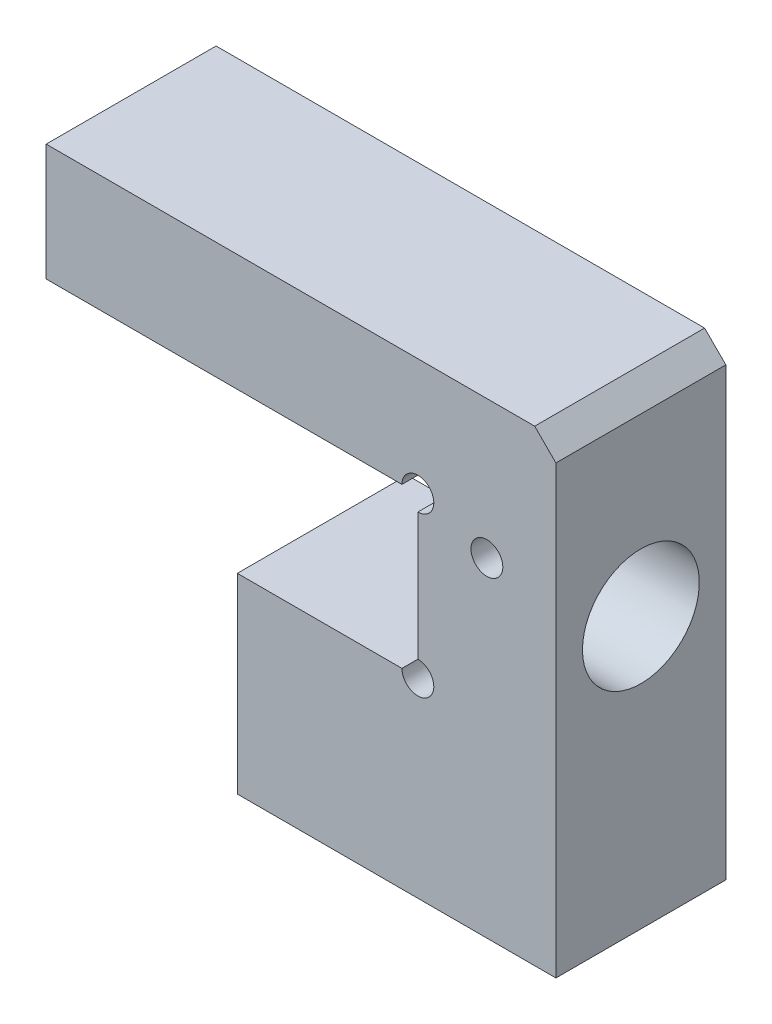
ISO-10303-21;
HEADER;
FILE_DESCRIPTION(('STEP AP214'),'2;1');
FILE_NAME('part.step','',(''),(''),'','','');
FILE_SCHEMA(('AUTOMOTIVE_DESIGN { 1 0 10303 214 1 1 1 1 }'));
ENDSEC;
DATA;
#1=APPLICATION_CONTEXT('core data for automotive mechanical design processes');
#2=APPLICATION_PROTOCOL_DEFINITION('international standard','automotive_design',2000,#1);
#3=PRODUCT_CONTEXT('',#1,'mechanical');
#4=PRODUCT('Part','Part','',(#3));
#5=PRODUCT_RELATED_PRODUCT_CATEGORY('part','',(#4));
#6=PRODUCT_DEFINITION_FORMATION('','',#4);
#7=PRODUCT_DEFINITION_CONTEXT('part definition',#1,'design');
#8=PRODUCT_DEFINITION('design','',#6,#7);
#9=PRODUCT_DEFINITION_SHAPE('','',#8);
#10=(LENGTH_UNIT() NAMED_UNIT(*) SI_UNIT(.MILLI.,.METRE.));
#11=(NAMED_UNIT(*) PLANE_ANGLE_UNIT() SI_UNIT($,.RADIAN.));
#12=(NAMED_UNIT(*) SI_UNIT($,.STERADIAN.) SOLID_ANGLE_UNIT());
#13=UNCERTAINTY_MEASURE_WITH_UNIT(LENGTH_MEASURE(1.E-05),#10,'distance_accuracy_value','');
#14=(GEOMETRIC_REPRESENTATION_CONTEXT(3) GLOBAL_UNCERTAINTY_ASSIGNED_CONTEXT((#13)) GLOBAL_UNIT_ASSIGNED_CONTEXT((#10,
#11,#12)) REPRESENTATION_CONTEXT('',''));
#15=CARTESIAN_POINT('',(0.,0.,0.));
#16=DIRECTION('',(0.,0.,1.));
#17=DIRECTION('',(1.,0.,0.));
#18=AXIS2_PLACEMENT_3D('',#15,#16,#17);
#19=CARTESIAN_POINT('',(35.,-26.,16.));
#20=DIRECTION('',(0.,0.,-1.));
#21=DIRECTION('',(-1.,0.,0.));
#22=AXIS2_PLACEMENT_3D('',#19,#20,#21);
#23=CYLINDRICAL_SURFACE('',#22,1.5);
#24=CARTESIAN_POINT('',(35.,-26.,0.));
#25=DIRECTION('',(0.,0.,1.));
#26=DIRECTION('',(1.,0.,0.));
#27=AXIS2_PLACEMENT_3D('',#24,#25,#26);
#28=CIRCLE('',#27,1.5);
#29=CARTESIAN_POINT('',(33.5,-26.,0.));
#30=VERTEX_POINT('',#29);
#31=CARTESIAN_POINT('',(35.,-24.5,0.));
#32=VERTEX_POINT('',#31);
#33=EDGE_CURVE('E134',#30,#32,#28,.T.);
#34=ORIENTED_EDGE('',*,*,#33,.F.);
#35=DIRECTION('',(0.,0.,-1.));
#36=VECTOR('',#35,1.);
#37=CARTESIAN_POINT('',(33.5,-26.,16.));
#38=LINE('',#37,#36);
#39=CARTESIAN_POINT('',(33.5,-26.,16.));
#40=VERTEX_POINT('',#39);
#41=EDGE_CURVE('E129',#40,#30,#38,.T.);
#42=ORIENTED_EDGE('',*,*,#41,.F.);
#43=CARTESIAN_POINT('',(35.,-26.,16.));
#44=DIRECTION('',(0.,0.,1.));
#45=DIRECTION('',(1.,0.,0.));
#46=AXIS2_PLACEMENT_3D('',#43,#44,#45);
#47=CIRCLE('',#46,1.5);
#48=CARTESIAN_POINT('',(35.,-24.5,16.));
#49=VERTEX_POINT('',#48);
#50=EDGE_CURVE('E132',#40,#49,#47,.T.);
#51=ORIENTED_EDGE('',*,*,#50,.T.);
#52=DIRECTION('',(0.,0.,-1.));
#53=VECTOR('',#52,1.);
#54=CARTESIAN_POINT('',(35.,-24.5,16.));
#55=LINE('',#54,#53);
#56=EDGE_CURVE('E192',#49,#32,#55,.T.);
#57=ORIENTED_EDGE('',*,*,#56,.T.);
#58=EDGE_LOOP('',(#34,#42,#51,#57));
#59=FACE_BOUND('',#58,.T.);
#60=ADVANCED_FACE('F46',(#59),#23,.F.);
#61=CARTESIAN_POINT('',(0.,-26.,16.));
#62=DIRECTION('',(0.,-1.,0.));
#63=DIRECTION('',(1.,0.,0.));
#64=AXIS2_PLACEMENT_3D('',#61,#62,#63);
#65=PLANE('',#64);
#66=DIRECTION('',(-1.,0.,0.));
#67=VECTOR('',#66,1.);
#68=CARTESIAN_POINT('',(0.,-26.,0.));
#69=LINE('',#68,#67);
#70=CARTESIAN_POINT('',(18.,-26.,0.));
#71=VERTEX_POINT('',#70);
#72=EDGE_CURVE('E200',#30,#71,#69,.T.);
#73=ORIENTED_EDGE('',*,*,#72,.T.);
#74=DIRECTION('',(0.,0.,-1.));
#75=VECTOR('',#74,1.);
#76=CARTESIAN_POINT('',(18.,-26.,16.));
#77=LINE('',#76,#75);
#78=CARTESIAN_POINT('',(18.,-26.,16.));
#79=VERTEX_POINT('',#78);
#80=EDGE_CURVE('E140',#79,#71,#77,.T.);
#81=ORIENTED_EDGE('',*,*,#80,.F.);
#82=DIRECTION('',(-1.,0.,0.));
#83=VECTOR('',#82,1.);
#84=CARTESIAN_POINT('',(0.,-26.,16.));
#85=LINE('',#84,#83);
#86=EDGE_CURVE('E144',#40,#79,#85,.T.);
#87=ORIENTED_EDGE('',*,*,#86,.F.);
#88=ORIENTED_EDGE('',*,*,#41,.T.);
#89=EDGE_LOOP('',(#73,#81,#87,#88));
#90=FACE_BOUND('',#89,.T.);
#91=ADVANCED_FACE('F145',(#90),#65,.F.);
#92=CARTESIAN_POINT('',(18.,0.,16.));
#93=DIRECTION('',(1.,0.,0.));
#94=DIRECTION('',(0.,1.,0.));
#95=AXIS2_PLACEMENT_3D('',#92,#93,#94);
#96=PLANE('',#95);
#97=DIRECTION('',(0.,-1.,0.));
#98=VECTOR('',#97,1.);
#99=CARTESIAN_POINT('',(18.,0.,0.));
#100=LINE('',#99,#98);
#101=CARTESIAN_POINT('',(18.,-44.,0.));
#102=VERTEX_POINT('',#101);
#103=EDGE_CURVE('E203',#71,#102,#100,.T.);
#104=ORIENTED_EDGE('',*,*,#103,.T.);
#105=DIRECTION('',(0.,0.,-1.));
#106=VECTOR('',#105,1.);
#107=CARTESIAN_POINT('',(18.,-44.,16.));
#108=LINE('',#107,#106);
#109=CARTESIAN_POINT('',(18.,-44.,16.));
#110=VERTEX_POINT('',#109);
#111=EDGE_CURVE('E251',#110,#102,#108,.T.);
#112=ORIENTED_EDGE('',*,*,#111,.F.);
#113=DIRECTION('',(0.,-1.,0.));
#114=VECTOR('',#113,1.);
#115=CARTESIAN_POINT('',(18.,0.,16.));
#116=LINE('',#115,#114);
#117=EDGE_CURVE('E150',#79,#110,#116,.T.);
#118=ORIENTED_EDGE('',*,*,#117,.F.);
#119=ORIENTED_EDGE('',*,*,#80,.T.);
#120=EDGE_LOOP('',(#104,#112,#118,#119));
#121=FACE_BOUND('',#120,.T.);
#122=ADVANCED_FACE('F291',(#121),#96,.F.);
#123=CARTESIAN_POINT('',(0.,-44.,16.));
#124=DIRECTION('',(0.,1.,0.));
#125=DIRECTION('',(0.,0.,1.));
#126=AXIS2_PLACEMENT_3D('',#123,#124,#125);
#127=PLANE('',#126);
#128=CARTESIAN_POINT('',(41.5,-44.,8.));
#129=DIRECTION('',(0.,-1.,0.));
#130=DIRECTION('',(0.,0.,-1.));
#131=AXIS2_PLACEMENT_3D('',#128,#129,#130);
#132=CIRCLE('',#131,3.);
#133=CARTESIAN_POINT('',(41.5,-44.,5.));
#134=VERTEX_POINT('',#133);
#135=EDGE_CURVE('E521',#134,#134,#132,.T.);
#136=ORIENTED_EDGE('',*,*,#135,.F.);
#137=EDGE_LOOP('',(#136));
#138=FACE_BOUND('',#137,.T.);
#139=DIRECTION('',(1.,0.,0.));
#140=VECTOR('',#139,1.);
#141=CARTESIAN_POINT('',(0.,-44.,0.));
#142=LINE('',#141,#140);
#143=CARTESIAN_POINT('',(48.,-44.,0.));
#144=VERTEX_POINT('',#143);
#145=EDGE_CURVE('E207',#102,#144,#142,.T.);
#146=ORIENTED_EDGE('',*,*,#145,.T.);
#147=DIRECTION('',(0.,0.,-1.));
#148=VECTOR('',#147,1.);
#149=CARTESIAN_POINT('',(48.,-44.,16.));
#150=LINE('',#149,#148);
#151=CARTESIAN_POINT('',(48.,-44.,16.));
#152=VERTEX_POINT('',#151);
#153=EDGE_CURVE('E247',#152,#144,#150,.T.);
#154=ORIENTED_EDGE('',*,*,#153,.F.);
#155=DIRECTION('',(1.,0.,0.));
#156=VECTOR('',#155,1.);
#157=CARTESIAN_POINT('',(0.,-44.,16.));
#158=LINE('',#157,#156);
#159=EDGE_CURVE('E168',#110,#152,#158,.T.);
#160=ORIENTED_EDGE('',*,*,#159,.F.);
#161=ORIENTED_EDGE('',*,*,#111,.T.);
#162=EDGE_LOOP('',(#146,#154,#160,#161));
#163=FACE_BOUND('',#162,.T.);
#164=ADVANCED_FACE('F333',(#138,#163),#127,.F.);
#165=CARTESIAN_POINT('',(48.,0.,16.));
#166=DIRECTION('',(1.,0.,0.));
#167=DIRECTION('',(0.,1.,0.));
#168=AXIS2_PLACEMENT_3D('',#165,#166,#167);
#169=PLANE('',#168);
#170=CARTESIAN_POINT('',(48.,-18.5,8.));
#171=DIRECTION('',(-1.,0.,0.));
#172=DIRECTION('',(0.,0.,1.));
#173=AXIS2_PLACEMENT_3D('',#170,#171,#172);
#174=CIRCLE('',#173,5.5);
#175=CARTESIAN_POINT('',(48.,-18.5,13.5));
#176=VERTEX_POINT('',#175);
#177=EDGE_CURVE('E306',#176,#176,#174,.T.);
#178=ORIENTED_EDGE('',*,*,#177,.T.);
#179=EDGE_LOOP('',(#178));
#180=FACE_BOUND('',#179,.T.);
#181=DIRECTION('',(0.,-1.,0.));
#182=VECTOR('',#181,1.);
#183=CARTESIAN_POINT('',(48.,0.,0.));
#184=LINE('',#183,#182);
#185=CARTESIAN_POINT('',(48.,-2.00000000000002,0.));
#186=VERTEX_POINT('',#185);
#187=EDGE_CURVE('E211',#186,#144,#184,.T.);
#188=ORIENTED_EDGE('',*,*,#187,.F.);
#189=DIRECTION('',(0.,0.,1.));
#190=VECTOR('',#189,1.);
#191=CARTESIAN_POINT('',(48.,-2.00000000000002,16.));
#192=LINE('',#191,#190);
#193=CARTESIAN_POINT('',(48.,-2.00000000000002,16.));
#194=VERTEX_POINT('',#193);
#195=EDGE_CURVE('E56',#186,#194,#192,.T.);
#196=ORIENTED_EDGE('',*,*,#195,.T.);
#197=DIRECTION('',(0.,-1.,0.));
#198=VECTOR('',#197,1.);
#199=CARTESIAN_POINT('',(48.,0.,16.));
#200=LINE('',#199,#198);
#201=EDGE_CURVE('E172',#194,#152,#200,.T.);
#202=ORIENTED_EDGE('',*,*,#201,.T.);
#203=ORIENTED_EDGE('',*,*,#153,.T.);
#204=EDGE_LOOP('',(#188,#196,#202,#203));
#205=FACE_BOUND('',#204,.T.);
#206=ADVANCED_FACE('F330',(#180,#205),#169,.T.);
#207=CARTESIAN_POINT('',(0.,0.,16.));
#208=DIRECTION('',(0.,1.,0.));
#209=DIRECTION('',(0.,0.,1.));
#210=AXIS2_PLACEMENT_3D('',#207,#208,#209);
#211=PLANE('',#210);
#212=DIRECTION('',(1.,0.,0.));
#213=VECTOR('',#212,1.);
#214=CARTESIAN_POINT('',(0.,0.,16.));
#215=LINE('',#214,#213);
#216=CARTESIAN_POINT('',(0.,0.,16.));
#217=VERTEX_POINT('',#216);
#218=CARTESIAN_POINT('',(46.,0.,16.));
#219=VERTEX_POINT('',#218);
#220=EDGE_CURVE('E175',#217,#219,#215,.T.);
#221=ORIENTED_EDGE('',*,*,#220,.T.);
#222=DIRECTION('',(0.,0.,-1.));
#223=VECTOR('',#222,1.);
#224=CARTESIAN_POINT('',(46.,0.,16.));
#225=LINE('',#224,#223);
#226=CARTESIAN_POINT('',(46.,0.,0.));
#227=VERTEX_POINT('',#226);
#228=EDGE_CURVE('E139',#219,#227,#225,.T.);
#229=ORIENTED_EDGE('',*,*,#228,.T.);
#230=DIRECTION('',(1.,0.,0.));
#231=VECTOR('',#230,1.);
#232=CARTESIAN_POINT('',(0.,0.,0.));
#233=LINE('',#232,#231);
#234=CARTESIAN_POINT('',(0.,0.,0.));
#235=VERTEX_POINT('',#234);
#236=EDGE_CURVE('E214',#235,#227,#233,.T.);
#237=ORIENTED_EDGE('',*,*,#236,.F.);
#238=DIRECTION('',(0.,0.,-1.));
#239=VECTOR('',#238,1.);
#240=CARTESIAN_POINT('',(0.,0.,16.));
#241=LINE('',#240,#239);
#242=EDGE_CURVE('E244',#217,#235,#241,.T.);
#243=ORIENTED_EDGE('',*,*,#242,.F.);
#244=EDGE_LOOP('',(#221,#229,#237,#243));
#245=FACE_BOUND('',#244,.T.);
#246=ADVANCED_FACE('F265',(#245),#211,.T.);
#247=CARTESIAN_POINT('',(0.,0.,16.));
#248=DIRECTION('',(1.,0.,0.));
#249=DIRECTION('',(0.,1.,0.));
#250=AXIS2_PLACEMENT_3D('',#247,#248,#249);
#251=PLANE('',#250);
#252=DIRECTION('',(0.,-1.,0.));
#253=VECTOR('',#252,1.);
#254=CARTESIAN_POINT('',(0.,0.,0.));
#255=LINE('',#254,#253);
#256=CARTESIAN_POINT('',(0.,-11.,0.));
#257=VERTEX_POINT('',#256);
#258=EDGE_CURVE('E217',#235,#257,#255,.T.);
#259=ORIENTED_EDGE('',*,*,#258,.T.);
#260=DIRECTION('',(0.,0.,-1.));
#261=VECTOR('',#260,1.);
#262=CARTESIAN_POINT('',(0.,-11.,16.));
#263=LINE('',#262,#261);
#264=CARTESIAN_POINT('',(0.,-11.,16.));
#265=VERTEX_POINT('',#264);
#266=EDGE_CURVE('E240',#265,#257,#263,.T.);
#267=ORIENTED_EDGE('',*,*,#266,.F.);
#268=DIRECTION('',(0.,-1.,0.));
#269=VECTOR('',#268,1.);
#270=CARTESIAN_POINT('',(0.,0.,16.));
#271=LINE('',#270,#269);
#272=EDGE_CURVE('E179',#217,#265,#271,.T.);
#273=ORIENTED_EDGE('',*,*,#272,.F.);
#274=ORIENTED_EDGE('',*,*,#242,.T.);
#275=EDGE_LOOP('',(#259,#267,#273,#274));
#276=FACE_BOUND('',#275,.T.);
#277=ADVANCED_FACE('F273',(#276),#251,.F.);
#278=CARTESIAN_POINT('',(0.,-11.,16.));
#279=DIRECTION('',(0.,1.,0.));
#280=DIRECTION('',(0.,0.,1.));
#281=AXIS2_PLACEMENT_3D('',#278,#279,#280);
#282=PLANE('',#281);
#283=DIRECTION('',(1.,0.,0.));
#284=VECTOR('',#283,1.);
#285=CARTESIAN_POINT('',(0.,-11.,0.));
#286=LINE('',#285,#284);
#287=CARTESIAN_POINT('',(33.5,-11.,0.));
#288=VERTEX_POINT('',#287);
#289=EDGE_CURVE('E221',#257,#288,#286,.T.);
#290=ORIENTED_EDGE('',*,*,#289,.T.);
#291=DIRECTION('',(0.,0.,-1.));
#292=VECTOR('',#291,1.);
#293=CARTESIAN_POINT('',(33.5,-11.,16.));
#294=LINE('',#293,#292);
#295=CARTESIAN_POINT('',(33.5,-11.,16.));
#296=VERTEX_POINT('',#295);
#297=EDGE_CURVE('E237',#296,#288,#294,.T.);
#298=ORIENTED_EDGE('',*,*,#297,.F.);
#299=DIRECTION('',(1.,0.,0.));
#300=VECTOR('',#299,1.);
#301=CARTESIAN_POINT('',(0.,-11.,16.));
#302=LINE('',#301,#300);
#303=EDGE_CURVE('E183',#265,#296,#302,.T.);
#304=ORIENTED_EDGE('',*,*,#303,.F.);
#305=ORIENTED_EDGE('',*,*,#266,.T.);
#306=EDGE_LOOP('',(#290,#298,#304,#305));
#307=FACE_BOUND('',#306,.T.);
#308=ADVANCED_FACE('F321',(#307),#282,.F.);
#309=CARTESIAN_POINT('',(35.,-11.,16.));
#310=DIRECTION('',(0.,0.,-1.));
#311=DIRECTION('',(-1.,0.,0.));
#312=AXIS2_PLACEMENT_3D('',#309,#310,#311);
#313=CYLINDRICAL_SURFACE('',#312,1.5);
#314=CARTESIAN_POINT('',(35.,-11.,0.));
#315=DIRECTION('',(0.,0.,1.));
#316=DIRECTION('',(1.,0.,0.));
#317=AXIS2_PLACEMENT_3D('',#314,#315,#316);
#318=CIRCLE('',#317,1.5);
#319=CARTESIAN_POINT('',(35.,-12.5,0.));
#320=VERTEX_POINT('',#319);
#321=EDGE_CURVE('E225',#320,#288,#318,.T.);
#322=ORIENTED_EDGE('',*,*,#321,.F.);
#323=DIRECTION('',(0.,0.,-1.));
#324=VECTOR('',#323,1.);
#325=CARTESIAN_POINT('',(35.,-12.5,16.));
#326=LINE('',#325,#324);
#327=CARTESIAN_POINT('',(35.,-12.5,16.));
#328=VERTEX_POINT('',#327);
#329=EDGE_CURVE('E234',#328,#320,#326,.T.);
#330=ORIENTED_EDGE('',*,*,#329,.F.);
#331=CARTESIAN_POINT('',(35.,-11.,16.));
#332=DIRECTION('',(0.,0.,1.));
#333=DIRECTION('',(1.,0.,0.));
#334=AXIS2_PLACEMENT_3D('',#331,#332,#333);
#335=CIRCLE('',#334,1.5);
#336=EDGE_CURVE('E186',#328,#296,#335,.T.);
#337=ORIENTED_EDGE('',*,*,#336,.T.);
#338=ORIENTED_EDGE('',*,*,#297,.T.);
#339=EDGE_LOOP('',(#322,#330,#337,#338));
#340=FACE_BOUND('',#339,.T.);
#341=ADVANCED_FACE('F298',(#340),#313,.F.);
#342=CARTESIAN_POINT('',(41.5,-13.,16.));
#343=DIRECTION('',(0.,0.,-1.));
#344=DIRECTION('',(-1.,0.,0.));
#345=AXIS2_PLACEMENT_3D('',#342,#343,#344);
#346=CYLINDRICAL_SURFACE('',#345,1.5);
#347=CARTESIAN_POINT('',(40.,-13.,8.));
#348=CARTESIAN_POINT('',(40.0000050460556,-12.999999264418,8.12652755992512));
#349=CARTESIAN_POINT('',(39.999982311627,-13.0043670886456,8.25304110628278));
#350=CARTESIAN_POINT('',(40.0001319667409,-13.0218180023314,8.50550114134522));
#351=CARTESIAN_POINT('',(40.0003043984022,-13.0349029727908,8.63144750175515));
#352=CARTESIAN_POINT('',(40.0015215467077,-13.0697504218392,8.88229698887765));
#353=CARTESIAN_POINT('',(40.0025674113019,-13.0915243005562,9.00719852406653));
#354=CARTESIAN_POINT('',(40.0066635692424,-13.1436366475958,9.25515427577499));
#355=CARTESIAN_POINT('',(40.0097134152429,-13.1739732036222,9.37820889830912));
#356=CARTESIAN_POINT('',(40.018334242777,-13.2353693960465,9.59479655254642));
#357=CARTESIAN_POINT('',(40.0231965938462,-13.2647784176286,9.68882762063051));
#358=CARTESIAN_POINT('',(40.0360572125426,-13.3285274262398,9.87497887554695));
#359=CARTESIAN_POINT('',(40.0440548849326,-13.3628664765249,9.96709942159652));
#360=CARTESIAN_POINT('',(40.064319567435,-13.4361965341698,10.1488311646454));
#361=CARTESIAN_POINT('',(40.076579488947,-13.4751797474417,10.2384462627795));
#362=CARTESIAN_POINT('',(40.1067416181981,-13.5574479769443,10.4146698889756));
#363=CARTESIAN_POINT('',(40.1246409806222,-13.6007308163241,10.5012799088057));
#364=CARTESIAN_POINT('',(40.1726849316218,-13.7014565402623,10.6903395491381));
#365=CARTESIAN_POINT('',(40.2047034683073,-13.7598601494252,10.7918239108702));
#366=CARTESIAN_POINT('',(40.2833193148084,-13.8802528014961,10.9868017577228));
#367=CARTESIAN_POINT('',(40.3298976997482,-13.9422371054464,11.0803054164453));
#368=CARTESIAN_POINT('',(40.4265252496017,-14.0494615544748,11.2324832066374));
#369=CARTESIAN_POINT('',(40.4723269798451,-14.0947534697852,11.2937909277011));
#370=CARTESIAN_POINT('',(40.5750767790373,-14.1828259418697,11.4084011892389));
#371=CARTESIAN_POINT('',(40.6320074443272,-14.2256102859632,11.4617160020786));
#372=CARTESIAN_POINT('',(40.7436899811321,-14.2966722780706,11.5474554053403));
#373=CARTESIAN_POINT('',(40.7961697927703,-14.3260714006203,11.581895861046));
#374=CARTESIAN_POINT('',(40.9078519592442,-14.3795598356942,11.6432994174372));
#375=CARTESIAN_POINT('',(40.967051861625,-14.4036510759174,11.6702652336588));
#376=CARTESIAN_POINT('',(41.0915540027052,-14.4448182093362,11.7157043872351));
#377=CARTESIAN_POINT('',(41.1569009496812,-14.4618368992159,11.7341086151923));
#378=CARTESIAN_POINT('',(41.2912422736374,-14.4869686414872,11.7611077099506));
#379=CARTESIAN_POINT('',(41.3602338680508,-14.4950883878025,11.7697099501529));
#380=CARTESIAN_POINT('',(41.4900473226128,-14.5011866968422,11.7761756729014));
#381=CARTESIAN_POINT('',(41.5507556366204,-14.5003542632437,11.7752981525243));
#382=CARTESIAN_POINT('',(41.6710117332296,-14.4914377140364,11.765829368413));
#383=CARTESIAN_POINT('',(41.7305597918081,-14.4833553449451,11.7572399624799));
#384=CARTESIAN_POINT('',(41.8447369023462,-14.4609676074607,11.733158431321));
#385=CARTESIAN_POINT('',(41.8994651925059,-14.4468901202217,11.7179186170347));
#386=CARTESIAN_POINT('',(42.0050642955728,-14.4134990852317,11.6811851206613));
#387=CARTESIAN_POINT('',(42.0559344406832,-14.3941846336623,11.6596903590211));
#388=CARTESIAN_POINT('',(42.1574533555582,-14.3494832412946,11.6089399925611));
#389=CARTESIAN_POINT('',(42.207663593704,-14.3237044239853,11.5791573179122));
#390=CARTESIAN_POINT('',(42.3021376648118,-14.2686883253997,11.5139478081336));
#391=CARTESIAN_POINT('',(42.3463979457714,-14.2394489976807,11.4785176288994));
#392=CARTESIAN_POINT('',(42.4528586029308,-14.1612913106921,11.3810364295307));
#393=CARTESIAN_POINT('',(42.5106382798919,-14.1107683175695,11.3154366963677));
#394=CARTESIAN_POINT('',(42.6128165548254,-14.0084154161653,11.1754109081402));
#395=CARTESIAN_POINT('',(42.6571815607545,-13.9565825734836,11.10096333517));
#396=CARTESIAN_POINT('',(42.7261529933264,-13.8654808655544,10.9625238598628));
#397=CARTESIAN_POINT('',(42.7529581556088,-13.8259310648425,10.8997790524862));
#398=CARTESIAN_POINT('',(42.8007005843685,-13.7484980516631,10.7710774542215));
#399=CARTESIAN_POINT('',(42.8216343778249,-13.7106158367238,10.7051187892368));
#400=CARTESIAN_POINT('',(42.8586263950086,-13.6370496240798,10.5705269505919));
#401=CARTESIAN_POINT('',(42.8746761770893,-13.6013695164315,10.5018893750078));
#402=CARTESIAN_POINT('',(42.9027368940712,-13.5326395799606,10.3624937816372));
#403=CARTESIAN_POINT('',(42.9147464041871,-13.499590682153,10.2917350253852));
#404=CARTESIAN_POINT('',(42.9426063168664,-13.4147747344694,10.0994862103933));
#405=CARTESIAN_POINT('',(42.9554692628489,-13.3656579776342,9.97638586883114));
#406=CARTESIAN_POINT('',(42.9750366354042,-13.2763195723764,9.72650097346295));
#407=CARTESIAN_POINT('',(42.9817369877003,-13.2361038219979,9.59971403938928));
#408=CARTESIAN_POINT('',(42.9913396986822,-13.1649136604004,9.34334042976084));
#409=CARTESIAN_POINT('',(42.9942392170035,-13.1339461737407,9.2137517338734));
#410=CARTESIAN_POINT('',(42.9980145402145,-13.0815009288207,8.95267823299505));
#411=CARTESIAN_POINT('',(42.9988907699241,-13.0600211792325,8.8211938318711));
#412=CARTESIAN_POINT('',(42.9998823727309,-13.0257732254375,8.54999759612709));
#413=CARTESIAN_POINT('',(42.9999549098346,-13.0135277038558,8.41021937711491));
#414=CARTESIAN_POINT('',(43.0000156997697,-12.9997516795259,8.13012319267219));
#415=CARTESIAN_POINT('',(43.0000039440339,-12.9982222659377,7.9898051738278));
#416=CARTESIAN_POINT('',(42.9999932361439,-13.005890966899,7.70940551883653));
#417=CARTESIAN_POINT('',(42.9999942892487,-13.0150934862396,7.56932400339871));
#418=CARTESIAN_POINT('',(42.9994201150092,-13.0441790370849,7.29028909646159));
#419=CARTESIAN_POINT('',(42.9988449641385,-13.0640606511037,7.15133555772498));
#420=CARTESIAN_POINT('',(42.9960168180687,-13.1114741668456,6.89131541217134));
#421=CARTESIAN_POINT('',(42.9939652502822,-13.1378574798256,6.77003625510019));
#422=CARTESIAN_POINT('',(42.9870906278171,-13.1987518691786,6.5295749167285));
#423=CARTESIAN_POINT('',(42.9822670114085,-13.2332645920647,6.41039316549427));
#424=CARTESIAN_POINT('',(42.96811736611,-13.3100879888254,6.17514862522296));
#425=CARTESIAN_POINT('',(42.9588025385292,-13.3523791015512,6.05907883101493));
#426=CARTESIAN_POINT('',(42.933460771756,-13.4443723933926,5.83072409678411));
#427=CARTESIAN_POINT('',(42.9174390661743,-13.4940687744867,5.71843627921196));
#428=CARTESIAN_POINT('',(42.8757741590904,-13.6004448473875,5.49811934723013));
#429=CARTESIAN_POINT('',(42.8500726704525,-13.6571654181859,5.39012050394642));
#430=CARTESIAN_POINT('',(42.785546798799,-13.7758419134477,5.18100748092275));
#431=CARTESIAN_POINT('',(42.7467301636709,-13.8377947307459,5.07988927865812));
#432=CARTESIAN_POINT('',(42.6609988927762,-13.951918050756,4.90587086500836));
#433=CARTESIAN_POINT('',(42.6170532069484,-14.0036931403323,4.83127271435435));
#434=CARTESIAN_POINT('',(42.5157749691133,-14.106056618557,4.69080702988619));
#435=CARTESIAN_POINT('',(42.458468822692,-14.1566471341316,4.6249226715687));
#436=CARTESIAN_POINT('',(42.3470297670444,-14.2393240075133,4.52152956974138));
#437=CARTESIAN_POINT('',(42.2964297435432,-14.2726493067837,4.48122025143153));
#438=CARTESIAN_POINT('',(42.1874871157361,-14.3346463726469,4.40804742405073));
#439=CARTESIAN_POINT('',(42.129147059308,-14.3633196637213,4.37518147435496));
#440=CARTESIAN_POINT('',(42.0049060731816,-14.4140754793013,4.31805660699533));
#441=CARTESIAN_POINT('',(41.9389382705098,-14.4360924608701,4.29388286588466));
#442=CARTESIAN_POINT('',(41.8017900342678,-14.4710232259759,4.25593435387349));
#443=CARTESIAN_POINT('',(41.7306151146361,-14.4839464893411,4.24214875269697));
#444=CARTESIAN_POINT('',(41.596619754307,-14.4981717805153,4.22700952244811));
#445=CARTESIAN_POINT('',(41.534120283585,-14.5009097086893,4.22411896185867));
#446=CARTESIAN_POINT('',(41.4094458268174,-14.4985594477934,4.22660913565092));
#447=CARTESIAN_POINT('',(41.3472707278206,-14.4934741947823,4.23198676695977));
#448=CARTESIAN_POINT('',(41.2293961260053,-14.4765098984768,4.25011150867378));
#449=CARTESIAN_POINT('',(41.1735433861647,-14.465114848026,4.26233425070105));
#450=CARTESIAN_POINT('',(41.0651898467115,-14.4366902642852,4.29325579476388));
#451=CARTESIAN_POINT('',(41.0126892488125,-14.419660392303,4.31195498608255));
#452=CARTESIAN_POINT('',(40.9087115447686,-14.379738876374,4.35659560858092));
#453=CARTESIAN_POINT('',(40.8575234141257,-14.3565378742822,4.38292916929367));
#454=CARTESIAN_POINT('',(40.7606435558256,-14.3062684431777,4.44133382979856));
#455=CARTESIAN_POINT('',(40.714954996775,-14.2791978041145,4.47340821098033));
#456=CARTESIAN_POINT('',(40.6070105924866,-14.2077501010952,4.56035494531221));
#457=CARTESIAN_POINT('',(40.5484476655024,-14.161677401717,4.61842508415753));
#458=CARTESIAN_POINT('',(40.443602862499,-14.0672548608845,4.743173689708));
#459=CARTESIAN_POINT('',(40.3973489209634,-14.0189001281723,4.8098712349263));
#460=CARTESIAN_POINT('',(40.3253270948166,-13.9340527459432,4.93302610065158));
#461=CARTESIAN_POINT('',(40.2973035074905,-13.8974757115398,4.98814299260833));
#462=CARTESIAN_POINT('',(40.2466693516165,-13.8252926087894,5.10144480858042));
#463=CARTESIAN_POINT('',(40.2240617658739,-13.7896870850121,5.15963140177587));
#464=CARTESIAN_POINT('',(40.1834630023723,-13.7199725383309,5.27858475137554));
#465=CARTESIAN_POINT('',(40.1654799791534,-13.6858662456208,5.33935584820427));
#466=CARTESIAN_POINT('',(40.1334497774767,-13.6195913520087,5.46296701551331));
#467=CARTESIAN_POINT('',(40.1194040171164,-13.5874234525309,5.52580782236498));
#468=CARTESIAN_POINT('',(40.0859020203283,-13.5035595186949,5.69781010637653));
#469=CARTESIAN_POINT('',(40.0695413872557,-13.453956980528,5.80860255511292));
#470=CARTESIAN_POINT('',(40.0435445800227,-13.3619641936644,6.03392964403428));
#471=CARTESIAN_POINT('',(40.0339133986101,-13.3195793175252,6.1484669968477));
#472=CARTESIAN_POINT('',(40.019202013684,-13.2424449086965,6.38041477083803));
#473=CARTESIAN_POINT('',(40.014123934472,-13.2076989457291,6.49782650687465));
#474=CARTESIAN_POINT('',(40.0068134070139,-13.146116939912,6.73472633027423));
#475=CARTESIAN_POINT('',(40.0045799276369,-13.1192780335693,6.85421364933579));
#476=CARTESIAN_POINT('',(40.00103135815,-13.0643897212595,7.14343659644667));
#477=CARTESIAN_POINT('',(40.0004538973779,-13.0402473116577,7.31393521951932));
#478=CARTESIAN_POINT('',(39.9999350541431,-13.0080595872059,7.65629867360926));
#479=CARTESIAN_POINT('',(39.9999931469256,-13.0000009989978,7.8281622604654));
#480=CARTESIAN_POINT('',(40.,-13.,8.));
#481=B_SPLINE_CURVE_WITH_KNOTS('',3,(#347,#348,#349,#350,#351,#352,#353,#354,#355,#356,#357,
#358,#359,#360,#361,#362,#363,#364,#365,#366,#367,#368,#369,#370,#371,#372,#373,#374,#375,#376,
#377,#378,#379,#380,#381,#382,#383,#384,#385,#386,#387,#388,#389,#390,#391,#392,#393,#394,#395,
#396,#397,#398,#399,#400,#401,#402,#403,#404,#405,#406,#407,#408,#409,#410,#411,#412,#413,#414,
#415,#416,#417,#418,#419,#420,#421,#422,#423,#424,#425,#426,#427,#428,#429,#430,#431,#432,#433,
#434,#435,#436,#437,#438,#439,#440,#441,#442,#443,#444,#445,#446,#447,#448,#449,#450,#451,#452,
#453,#454,#455,#456,#457,#458,#459,#460,#461,#462,#463,#464,#465,#466,#467,#468,#469,#470,#471,
#472,#473,#474,#475,#476,#477,#478,#479,#480),.UNSPECIFIED.,.T.,.F.,(4,2,2,2,2,2,2,2,2,2,2,2,2,
2,2,2,2,2,2,2,2,2,2,2,2,2,2,2,2,2,2,2,2,2,2,2,2,2,2,2,2,2,2,2,2,2,2,2,2,2,2,2,2,2,2,2,2,2,2,2,2,
2,2,2,2,2,4),(0.,0.379483393616853,0.759048699358423,1.13911365307011,1.51909379423317,
1.814852736539,2.11055555651974,2.4057689235907,2.7008335820282,3.06409001220713,
3.42687623172283,3.69279584360618,3.958302884448,4.16544541012274,4.37251258200325,
4.58122338193485,4.78977707837343,4.97101410268542,5.15220747852011,5.32705440818306,
5.50193153292701,5.69266946016276,5.88352075310797,6.18470375083168,6.48663481942091,
6.72290458559341,6.95931381626844,7.19612937151052,7.43302835146072,7.83188915716065,
8.23101347262615,8.63043588411318,9.02977442320132,9.45030094674273,9.87087021098953,
10.2916121535398,10.712298262859,11.0844035518655,11.456584271171,11.8278415169845,
12.1988095962693,12.5720481444051,12.945066583011,13.2467382837044,13.5478187410918,
13.7653438236128,13.98279747769,14.2023273889092,14.421628108802,14.6084996402861,
14.7953010555402,14.969437390556,15.1435841942871,15.3290645892593,15.5146513433328,
15.7964650771119,16.078913018588,16.2941437834284,16.5094928132127,16.7252190060437,
16.9410227981803,17.3078970270511,17.6750431608511,18.0423605018527,18.4095446571121,
18.9253488843225,19.4407272618761),.UNSPECIFIED.);
#482=CARTESIAN_POINT('',(40.,-13.,8.));
#483=VERTEX_POINT('',#482);
#484=EDGE_CURVE('E197',#483,#483,#481,.T.);
#485=ORIENTED_EDGE('',*,*,#484,.F.);
#486=EDGE_LOOP('',(#485));
#487=FACE_BOUND('',#486,.T.);
#488=CARTESIAN_POINT('',(41.5,-13.,16.));
#489=DIRECTION('',(0.,0.,1.));
#490=DIRECTION('',(1.,0.,0.));
#491=AXIS2_PLACEMENT_3D('',#488,#489,#490);
#492=CIRCLE('',#491,1.5);
#493=CARTESIAN_POINT('',(43.,-13.,16.));
#494=VERTEX_POINT('',#493);
#495=EDGE_CURVE('E158',#494,#494,#492,.T.);
#496=ORIENTED_EDGE('',*,*,#495,.T.);
#497=EDGE_LOOP('',(#496));
#498=FACE_BOUND('',#497,.T.);
#499=CARTESIAN_POINT('',(41.5,-13.,0.));
#500=DIRECTION('',(0.,0.,1.));
#501=DIRECTION('',(1.,0.,0.));
#502=AXIS2_PLACEMENT_3D('',#499,#500,#501);
#503=CIRCLE('',#502,1.5);
#504=CARTESIAN_POINT('',(43.,-13.,0.));
#505=VERTEX_POINT('',#504);
#506=EDGE_CURVE('E193',#505,#505,#503,.T.);
#507=ORIENTED_EDGE('',*,*,#506,.F.);
#508=EDGE_LOOP('',(#507));
#509=FACE_BOUND('',#508,.T.);
#510=ADVANCED_FACE('F294',(#487,#498,#509),#346,.F.);
#511=CARTESIAN_POINT('',(35.,0.,16.));
#512=DIRECTION('',(1.,0.,0.));
#513=DIRECTION('',(0.,0.,-1.));
#514=AXIS2_PLACEMENT_3D('',#511,#512,#513);
#515=PLANE('',#514);
#516=CARTESIAN_POINT('',(35.,-18.5,8.));
#517=DIRECTION('',(-1.,0.,0.));
#518=DIRECTION('',(0.,0.,1.));
#519=AXIS2_PLACEMENT_3D('',#516,#517,#518);
#520=CIRCLE('',#519,5.5);
#521=CARTESIAN_POINT('',(35.,-18.5,13.5));
#522=VERTEX_POINT('',#521);
#523=EDGE_CURVE('E307',#522,#522,#520,.T.);
#524=ORIENTED_EDGE('',*,*,#523,.F.);
#525=EDGE_LOOP('',(#524));
#526=FACE_BOUND('',#525,.T.);
#527=DIRECTION('',(0.,-1.,0.));
#528=VECTOR('',#527,1.);
#529=CARTESIAN_POINT('',(35.,0.,0.));
#530=LINE('',#529,#528);
#531=EDGE_CURVE('E162',#320,#32,#530,.T.);
#532=ORIENTED_EDGE('',*,*,#531,.T.);
#533=ORIENTED_EDGE('',*,*,#56,.F.);
#534=DIRECTION('',(0.,-1.,0.));
#535=VECTOR('',#534,1.);
#536=CARTESIAN_POINT('',(35.,0.,16.));
#537=LINE('',#536,#535);
#538=EDGE_CURVE('E155',#328,#49,#537,.T.);
#539=ORIENTED_EDGE('',*,*,#538,.F.);
#540=ORIENTED_EDGE('',*,*,#329,.T.);
#541=EDGE_LOOP('',(#532,#533,#539,#540));
#542=FACE_BOUND('',#541,.T.);
#543=ADVANCED_FACE('F297',(#526,#542),#515,.F.);
#544=CARTESIAN_POINT('',(0.,0.,16.));
#545=DIRECTION('',(0.,0.,1.));
#546=DIRECTION('',(1.,0.,0.));
#547=AXIS2_PLACEMENT_3D('',#544,#545,#546);
#548=PLANE('',#547);
#549=ORIENTED_EDGE('',*,*,#495,.F.);
#550=EDGE_LOOP('',(#549));
#551=FACE_BOUND('',#550,.T.);
#552=ORIENTED_EDGE('',*,*,#201,.F.);
#553=DIRECTION('',(0.707106781186546,-0.707106781186549,0.));
#554=VECTOR('',#553,1.);
#555=CARTESIAN_POINT('',(23.0000000000001,23.,16.));
#556=LINE('',#555,#554);
#557=EDGE_CURVE('E11',#194,#219,#556,.F.);
#558=ORIENTED_EDGE('',*,*,#557,.T.);
#559=ORIENTED_EDGE('',*,*,#220,.F.);
#560=ORIENTED_EDGE('',*,*,#272,.T.);
#561=ORIENTED_EDGE('',*,*,#303,.T.);
#562=ORIENTED_EDGE('',*,*,#336,.F.);
#563=ORIENTED_EDGE('',*,*,#538,.T.);
#564=ORIENTED_EDGE('',*,*,#50,.F.);
#565=ORIENTED_EDGE('',*,*,#86,.T.);
#566=ORIENTED_EDGE('',*,*,#117,.T.);
#567=ORIENTED_EDGE('',*,*,#159,.T.);
#568=EDGE_LOOP('',(#552,#558,#559,#560,#561,#562,#563,#564,#565,#566,#567));
#569=FACE_BOUND('',#568,.T.);
#570=ADVANCED_FACE('F152',(#551,#569),#548,.T.);
#571=CARTESIAN_POINT('',(0.,0.,0.));
#572=DIRECTION('',(0.,0.,1.));
#573=DIRECTION('',(1.,0.,0.));
#574=AXIS2_PLACEMENT_3D('',#571,#572,#573);
#575=PLANE('',#574);
#576=ORIENTED_EDGE('',*,*,#506,.T.);
#577=EDGE_LOOP('',(#576));
#578=FACE_BOUND('',#577,.T.);
#579=ORIENTED_EDGE('',*,*,#236,.T.);
#580=DIRECTION('',(-0.707106781186546,0.707106781186549,0.));
#581=VECTOR('',#580,1.);
#582=CARTESIAN_POINT('',(46.,0.,0.));
#583=LINE('',#582,#581);
#584=EDGE_CURVE('E70',#227,#186,#583,.F.);
#585=ORIENTED_EDGE('',*,*,#584,.T.);
#586=ORIENTED_EDGE('',*,*,#187,.T.);
#587=ORIENTED_EDGE('',*,*,#145,.F.);
#588=ORIENTED_EDGE('',*,*,#103,.F.);
#589=ORIENTED_EDGE('',*,*,#72,.F.);
#590=ORIENTED_EDGE('',*,*,#33,.T.);
#591=ORIENTED_EDGE('',*,*,#531,.F.);
#592=ORIENTED_EDGE('',*,*,#321,.T.);
#593=ORIENTED_EDGE('',*,*,#289,.F.);
#594=ORIENTED_EDGE('',*,*,#258,.F.);
#595=EDGE_LOOP('',(#579,#585,#586,#587,#588,#589,#590,#591,#592,#593,#594));
#596=FACE_BOUND('',#595,.T.);
#597=ADVANCED_FACE('F270',(#578,#596),#575,.F.);
#598=CARTESIAN_POINT('',(46.,0.,16.));
#599=DIRECTION('',(-0.707106781186549,-0.707106781186546,0.));
#600=DIRECTION('',(0.,0.,-1.));
#601=AXIS2_PLACEMENT_3D('',#598,#599,#600);
#602=PLANE('',#601);
#603=ORIENTED_EDGE('',*,*,#557,.F.);
#604=ORIENTED_EDGE('',*,*,#195,.F.);
#605=ORIENTED_EDGE('',*,*,#584,.F.);
#606=ORIENTED_EDGE('',*,*,#228,.F.);
#607=EDGE_LOOP('',(#603,#604,#605,#606));
#608=FACE_BOUND('',#607,.T.);
#609=ADVANCED_FACE('F49',(#608),#602,.F.);
#610=CARTESIAN_POINT('',(48.,-18.5,8.));
#611=DIRECTION('',(-1.,0.,0.));
#612=DIRECTION('',(0.,0.,1.));
#613=AXIS2_PLACEMENT_3D('',#610,#611,#612);
#614=CYLINDRICAL_SURFACE('',#613,5.5);
#615=ORIENTED_EDGE('',*,*,#484,.T.);
#616=EDGE_LOOP('',(#615));
#617=FACE_BOUND('',#616,.T.);
#618=ORIENTED_EDGE('',*,*,#177,.F.);
#619=EDGE_LOOP('',(#618));
#620=FACE_BOUND('',#619,.T.);
#621=ORIENTED_EDGE('',*,*,#523,.T.);
#622=EDGE_LOOP('',(#621));
#623=FACE_BOUND('',#622,.T.);
#624=ADVANCED_FACE('F276',(#617,#620,#623),#614,.F.);
#625=CARTESIAN_POINT('',(41.5,-28.,8.));
#626=DIRECTION('',(0.,-1.,0.));
#627=DIRECTION('',(0.,0.,-1.));
#628=AXIS2_PLACEMENT_3D('',#625,#626,#627);
#629=CYLINDRICAL_SURFACE('',#628,3.);
#630=CARTESIAN_POINT('',(41.5,-28.,8.));
#631=DIRECTION('',(0.,-1.,0.));
#632=DIRECTION('',(0.,0.,-1.));
#633=AXIS2_PLACEMENT_3D('',#630,#631,#632);
#634=CIRCLE('',#633,3.);
#635=CARTESIAN_POINT('',(41.5,-28.,5.));
#636=VERTEX_POINT('',#635);
#637=EDGE_CURVE('E519',#636,#636,#634,.T.);
#638=ORIENTED_EDGE('',*,*,#637,.F.);
#639=EDGE_LOOP('',(#638));
#640=FACE_BOUND('',#639,.T.);
#641=ORIENTED_EDGE('',*,*,#135,.T.);
#642=EDGE_LOOP('',(#641));
#643=FACE_BOUND('',#642,.T.);
#644=ADVANCED_FACE('F281',(#640,#643),#629,.F.);
#645=CARTESIAN_POINT('',(41.5,-28.,8.));
#646=DIRECTION('',(0.,-1.,0.));
#647=DIRECTION('',(0.,0.,-1.));
#648=AXIS2_PLACEMENT_3D('',#645,#646,#647);
#649=PLANE('',#648);
#650=ORIENTED_EDGE('',*,*,#637,.T.);
#651=EDGE_LOOP('',(#650));
#652=FACE_BOUND('',#651,.T.);
#653=ADVANCED_FACE('F409',(#652),#649,.T.);
#654=CLOSED_SHELL('',(#60,#91,#122,#164,#206,#246,#277,#308,#341,#510,#543,#570,#597,#609,#624,
#644,#653));
#655=MANIFOLD_SOLID_BREP('B2',#654);
#656=ADVANCED_BREP_SHAPE_REPRESENTATION('',(#18,#655),#14);
#657=SHAPE_DEFINITION_REPRESENTATION(#9,#656);
ENDSEC;
END-ISO-10303-21;
